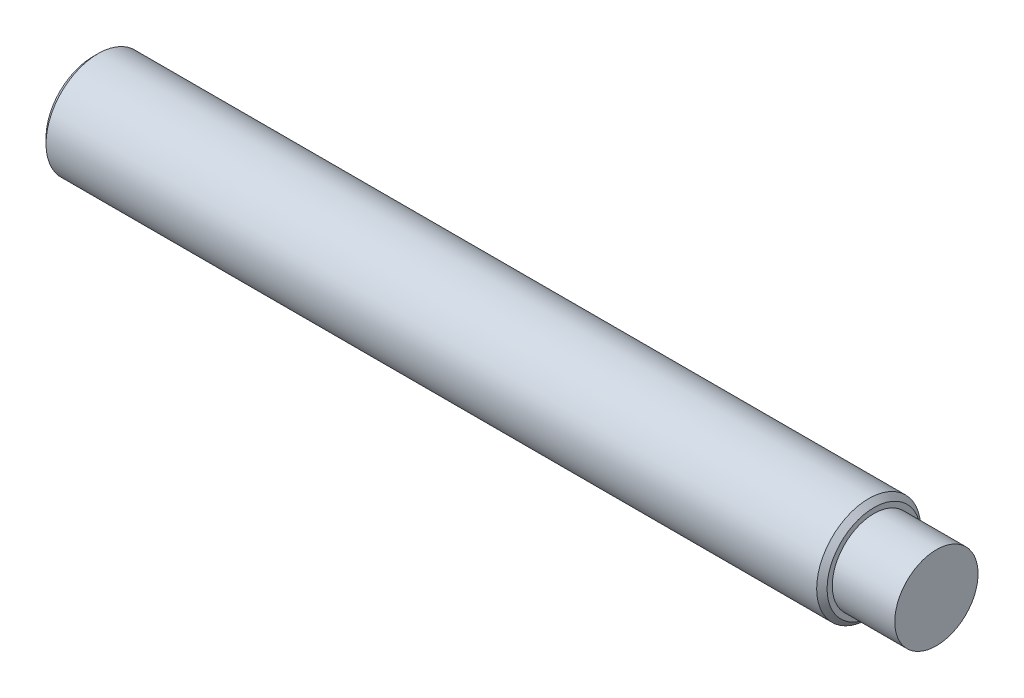
ISO-10303-21;
HEADER;
FILE_DESCRIPTION(('STEP AP214'),'2;1');
FILE_NAME('part.step','',(''),(''),'','','');
FILE_SCHEMA(('AUTOMOTIVE_DESIGN { 1 0 10303 214 1 1 1 1 }'));
ENDSEC;
DATA;
#1=APPLICATION_CONTEXT('core data for automotive mechanical design processes');
#2=APPLICATION_PROTOCOL_DEFINITION('international standard','automotive_design',2000,#1);
#3=PRODUCT_CONTEXT('',#1,'mechanical');
#4=PRODUCT('Part','Part','',(#3));
#5=PRODUCT_RELATED_PRODUCT_CATEGORY('part','',(#4));
#6=PRODUCT_DEFINITION_FORMATION('','',#4);
#7=PRODUCT_DEFINITION_CONTEXT('part definition',#1,'design');
#8=PRODUCT_DEFINITION('design','',#6,#7);
#9=PRODUCT_DEFINITION_SHAPE('','',#8);
#10=(LENGTH_UNIT() NAMED_UNIT(*) SI_UNIT(.MILLI.,.METRE.));
#11=(NAMED_UNIT(*) PLANE_ANGLE_UNIT() SI_UNIT($,.RADIAN.));
#12=(NAMED_UNIT(*) SI_UNIT($,.STERADIAN.) SOLID_ANGLE_UNIT());
#13=UNCERTAINTY_MEASURE_WITH_UNIT(LENGTH_MEASURE(1.E-05),#10,'distance_accuracy_value','');
#14=(GEOMETRIC_REPRESENTATION_CONTEXT(3) GLOBAL_UNCERTAINTY_ASSIGNED_CONTEXT((#13)) GLOBAL_UNIT_ASSIGNED_CONTEXT((#10,
#11,#12)) REPRESENTATION_CONTEXT('',''));
#15=CARTESIAN_POINT('',(0.,0.,0.));
#16=DIRECTION('',(0.,0.,1.));
#17=DIRECTION('',(1.,0.,0.));
#18=AXIS2_PLACEMENT_3D('',#15,#16,#17);
#19=CARTESIAN_POINT('',(0.,0.,0.));
#20=DIRECTION('',(1.,0.,0.));
#21=DIRECTION('',(0.,0.,-1.));
#22=AXIS2_PLACEMENT_3D('',#19,#20,#21);
#23=PLANE('',#22);
#24=CARTESIAN_POINT('',(0.,0.,0.));
#25=DIRECTION('',(-1.,0.,0.));
#26=DIRECTION('',(0.,0.,1.));
#27=AXIS2_PLACEMENT_3D('',#24,#25,#26);
#28=CIRCLE('',#27,2.);
#29=CARTESIAN_POINT('',(0.,0.,2.));
#30=VERTEX_POINT('',#29);
#31=EDGE_CURVE('E73',#30,#30,#28,.T.);
#32=ORIENTED_EDGE('',*,*,#31,.F.);
#33=EDGE_LOOP('',(#32));
#34=FACE_BOUND('',#33,.T.);
#35=CARTESIAN_POINT('',(0.,0.,0.));
#36=DIRECTION('',(1.,0.,0.));
#37=DIRECTION('',(0.,0.,-1.));
#38=AXIS2_PLACEMENT_3D('',#35,#36,#37);
#39=CIRCLE('',#38,4.5);
#40=CARTESIAN_POINT('',(0.,0.,-4.5));
#41=VERTEX_POINT('',#40);
#42=EDGE_CURVE('E10',#41,#41,#39,.F.);
#43=ORIENTED_EDGE('',*,*,#42,.T.);
#44=EDGE_LOOP('',(#43));
#45=FACE_BOUND('',#44,.T.);
#46=ADVANCED_FACE('F39',(#34,#45),#23,.F.);
#47=CARTESIAN_POINT('',(-21.6251223316182,0.,0.));
#48=DIRECTION('',(-1.,0.,0.));
#49=DIRECTION('',(0.,0.,1.));
#50=AXIS2_PLACEMENT_3D('',#47,#48,#49);
#51=CYLINDRICAL_SURFACE('',#50,5.);
#52=CARTESIAN_POINT('',(74.5,0.,0.));
#53=DIRECTION('',(-1.,0.,0.));
#54=DIRECTION('',(0.,0.,1.));
#55=AXIS2_PLACEMENT_3D('',#52,#53,#54);
#56=CIRCLE('',#55,5.);
#57=CARTESIAN_POINT('',(74.5,0.,5.));
#58=VERTEX_POINT('',#57);
#59=EDGE_CURVE('E53',#58,#58,#56,.T.);
#60=ORIENTED_EDGE('',*,*,#59,.T.);
#61=EDGE_LOOP('',(#60));
#62=FACE_BOUND('',#61,.T.);
#63=CARTESIAN_POINT('',(0.500000000000014,0.,0.));
#64=DIRECTION('',(1.,0.,0.));
#65=DIRECTION('',(0.,0.,-1.));
#66=AXIS2_PLACEMENT_3D('',#63,#64,#65);
#67=CIRCLE('',#66,5.);
#68=CARTESIAN_POINT('',(0.500000000000014,0.,-5.));
#69=VERTEX_POINT('',#68);
#70=EDGE_CURVE('E58',#69,#69,#67,.T.);
#71=ORIENTED_EDGE('',*,*,#70,.T.);
#72=EDGE_LOOP('',(#71));
#73=FACE_BOUND('',#72,.T.);
#74=ADVANCED_FACE('F90',(#62,#73),#51,.T.);
#75=CARTESIAN_POINT('',(75.,5.,0.));
#76=DIRECTION('',(-1.,0.,0.));
#77=DIRECTION('',(0.,0.,1.));
#78=AXIS2_PLACEMENT_3D('',#75,#76,#77);
#79=PLANE('',#78);
#80=CARTESIAN_POINT('',(75.,0.,0.));
#81=DIRECTION('',(-1.,0.,0.));
#82=DIRECTION('',(0.,0.,1.));
#83=AXIS2_PLACEMENT_3D('',#80,#81,#82);
#84=CIRCLE('',#83,4.50000000000002);
#85=CARTESIAN_POINT('',(75.,0.,4.50000000000002));
#86=VERTEX_POINT('',#85);
#87=EDGE_CURVE('E48',#86,#86,#84,.F.);
#88=ORIENTED_EDGE('',*,*,#87,.T.);
#89=EDGE_LOOP('',(#88));
#90=FACE_BOUND('',#89,.T.);
#91=CARTESIAN_POINT('',(75.,0.,0.));
#92=DIRECTION('',(-1.,0.,0.));
#93=DIRECTION('',(0.,0.,1.));
#94=AXIS2_PLACEMENT_3D('',#91,#92,#93);
#95=CIRCLE('',#94,4.);
#96=CARTESIAN_POINT('',(75.,0.,4.));
#97=VERTEX_POINT('',#96);
#98=EDGE_CURVE('E64',#97,#97,#95,.T.);
#99=ORIENTED_EDGE('',*,*,#98,.T.);
#100=EDGE_LOOP('',(#99));
#101=FACE_BOUND('',#100,.T.);
#102=ADVANCED_FACE('F95',(#90,#101),#79,.F.);
#103=CARTESIAN_POINT('',(-21.6251223316182,0.,0.));
#104=DIRECTION('',(-1.,0.,0.));
#105=DIRECTION('',(0.,0.,1.));
#106=AXIS2_PLACEMENT_3D('',#103,#104,#105);
#107=CYLINDRICAL_SURFACE('',#106,4.);
#108=ORIENTED_EDGE('',*,*,#98,.F.);
#109=EDGE_LOOP('',(#108));
#110=FACE_BOUND('',#109,.T.);
#111=CARTESIAN_POINT('',(81.,0.,0.));
#112=DIRECTION('',(-1.,0.,0.));
#113=DIRECTION('',(0.,0.,1.));
#114=AXIS2_PLACEMENT_3D('',#111,#112,#113);
#115=CIRCLE('',#114,4.);
#116=CARTESIAN_POINT('',(81.,0.,4.));
#117=VERTEX_POINT('',#116);
#118=EDGE_CURVE('E68',#117,#117,#115,.T.);
#119=ORIENTED_EDGE('',*,*,#118,.T.);
#120=EDGE_LOOP('',(#119));
#121=FACE_BOUND('',#120,.T.);
#122=ADVANCED_FACE('F111',(#110,#121),#107,.T.);
#123=CARTESIAN_POINT('',(81.,4.,0.));
#124=DIRECTION('',(-1.,0.,0.));
#125=DIRECTION('',(0.,0.,1.));
#126=AXIS2_PLACEMENT_3D('',#123,#124,#125);
#127=PLANE('',#126);
#128=ORIENTED_EDGE('',*,*,#118,.F.);
#129=EDGE_LOOP('',(#128));
#130=FACE_BOUND('',#129,.T.);
#131=ADVANCED_FACE('F104',(#130),#127,.F.);
#132=CARTESIAN_POINT('',(74.5,0.,0.));
#133=DIRECTION('',(-1.,0.,0.));
#134=DIRECTION('',(0.,0.,1.));
#135=AXIS2_PLACEMENT_3D('',#132,#133,#134);
#136=CONICAL_SURFACE('',#135,5.,0.785398163397465);
#137=ORIENTED_EDGE('',*,*,#87,.F.);
#138=EDGE_LOOP('',(#137));
#139=FACE_BOUND('',#138,.T.);
#140=ORIENTED_EDGE('',*,*,#59,.F.);
#141=EDGE_LOOP('',(#140));
#142=FACE_BOUND('',#141,.T.);
#143=ADVANCED_FACE('F100',(#139,#142),#136,.T.);
#144=CARTESIAN_POINT('',(0.,0.,0.));
#145=DIRECTION('',(1.,0.,0.));
#146=DIRECTION('',(0.,0.,-1.));
#147=AXIS2_PLACEMENT_3D('',#144,#145,#146);
#148=CONICAL_SURFACE('',#147,4.5,0.78539816339743);
#149=ORIENTED_EDGE('',*,*,#70,.F.);
#150=EDGE_LOOP('',(#149));
#151=FACE_BOUND('',#150,.T.);
#152=ORIENTED_EDGE('',*,*,#42,.F.);
#153=EDGE_LOOP('',(#152));
#154=FACE_BOUND('',#153,.T.);
#155=ADVANCED_FACE('F42',(#151,#154),#148,.T.);
#156=CARTESIAN_POINT('',(10.,0.,0.));
#157=DIRECTION('',(-1.,0.,0.));
#158=DIRECTION('',(0.,0.,1.));
#159=AXIS2_PLACEMENT_3D('',#156,#157,#158);
#160=CYLINDRICAL_SURFACE('',#159,2.);
#161=CARTESIAN_POINT('',(10.,0.,0.));
#162=DIRECTION('',(-1.,0.,0.));
#163=DIRECTION('',(0.,0.,1.));
#164=AXIS2_PLACEMENT_3D('',#161,#162,#163);
#165=CIRCLE('',#164,2.);
#166=CARTESIAN_POINT('',(10.,0.,2.));
#167=VERTEX_POINT('',#166);
#168=EDGE_CURVE('E72',#167,#167,#165,.T.);
#169=ORIENTED_EDGE('',*,*,#168,.F.);
#170=EDGE_LOOP('',(#169));
#171=FACE_BOUND('',#170,.T.);
#172=ORIENTED_EDGE('',*,*,#31,.T.);
#173=EDGE_LOOP('',(#172));
#174=FACE_BOUND('',#173,.T.);
#175=ADVANCED_FACE('F83',(#171,#174),#160,.F.);
#176=CARTESIAN_POINT('',(10.,0.,0.));
#177=DIRECTION('',(-1.,0.,0.));
#178=DIRECTION('',(0.,0.,1.));
#179=AXIS2_PLACEMENT_3D('',#176,#177,#178);
#180=PLANE('',#179);
#181=ORIENTED_EDGE('',*,*,#168,.T.);
#182=EDGE_LOOP('',(#181));
#183=FACE_BOUND('',#182,.T.);
#184=ADVANCED_FACE('F81',(#183),#180,.T.);
#185=CLOSED_SHELL('',(#46,#74,#102,#122,#131,#143,#155,#175,#184));
#186=MANIFOLD_SOLID_BREP('B2',#185);
#187=ADVANCED_BREP_SHAPE_REPRESENTATION('',(#18,#186),#14);
#188=SHAPE_DEFINITION_REPRESENTATION(#9,#187);
ENDSEC;
END-ISO-10303-21;
